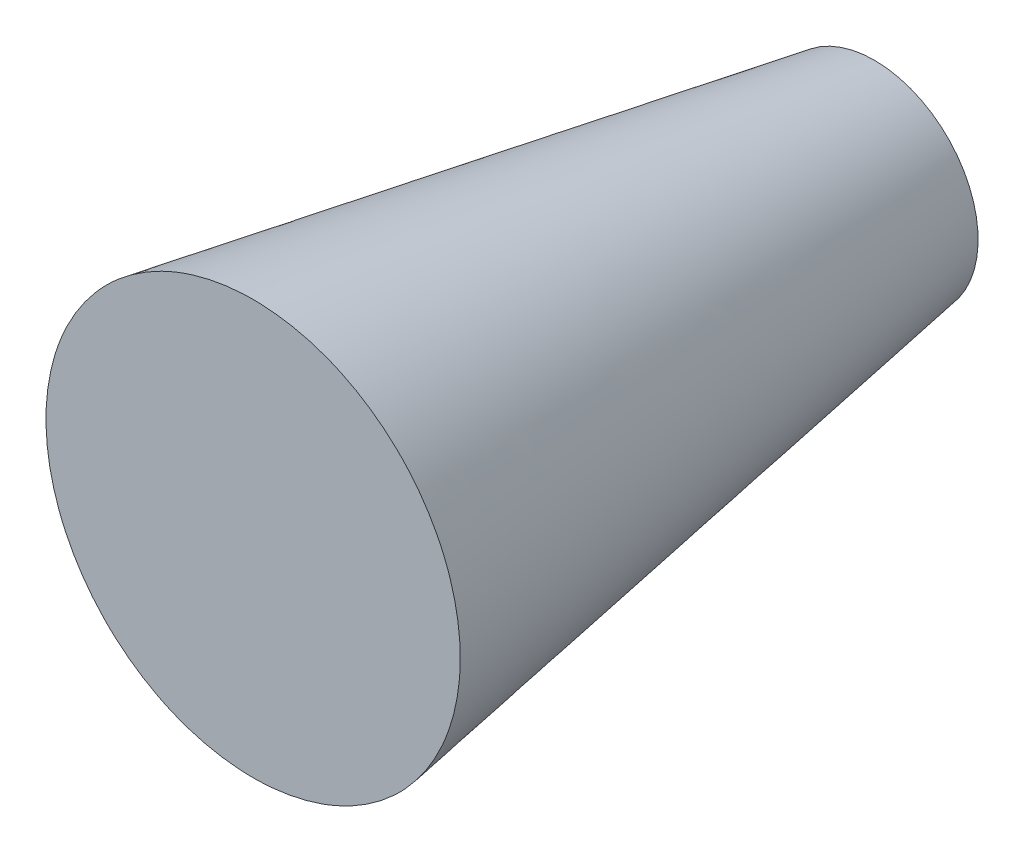
ISO-10303-21;
HEADER;
FILE_DESCRIPTION(('STEP AP214'),'2;1');
FILE_NAME('part.step','',(''),(''),'','','');
FILE_SCHEMA(('AUTOMOTIVE_DESIGN { 1 0 10303 214 1 1 1 1 }'));
ENDSEC;
DATA;
#1=APPLICATION_CONTEXT('core data for automotive mechanical design processes');
#2=APPLICATION_PROTOCOL_DEFINITION('international standard','automotive_design',2000,#1);
#3=PRODUCT_CONTEXT('',#1,'mechanical');
#4=PRODUCT('Part','Part','',(#3));
#5=PRODUCT_RELATED_PRODUCT_CATEGORY('part','',(#4));
#6=PRODUCT_DEFINITION_FORMATION('','',#4);
#7=PRODUCT_DEFINITION_CONTEXT('part definition',#1,'design');
#8=PRODUCT_DEFINITION('design','',#6,#7);
#9=PRODUCT_DEFINITION_SHAPE('','',#8);
#10=(LENGTH_UNIT() NAMED_UNIT(*) SI_UNIT(.MILLI.,.METRE.));
#11=(NAMED_UNIT(*) PLANE_ANGLE_UNIT() SI_UNIT($,.RADIAN.));
#12=(NAMED_UNIT(*) SI_UNIT($,.STERADIAN.) SOLID_ANGLE_UNIT());
#13=UNCERTAINTY_MEASURE_WITH_UNIT(LENGTH_MEASURE(1.E-05),#10,'distance_accuracy_value','');
#14=(GEOMETRIC_REPRESENTATION_CONTEXT(3) GLOBAL_UNCERTAINTY_ASSIGNED_CONTEXT((#13)) GLOBAL_UNIT_ASSIGNED_CONTEXT((#10,
#11,#12)) REPRESENTATION_CONTEXT('',''));
#15=CARTESIAN_POINT('',(0.,0.,0.));
#16=DIRECTION('',(0.,0.,1.));
#17=DIRECTION('',(1.,0.,0.));
#18=AXIS2_PLACEMENT_3D('',#15,#16,#17);
#19=CARTESIAN_POINT('',(0.,0.,30.));
#20=DIRECTION('',(0.,0.,1.));
#21=DIRECTION('',(1.,0.,0.));
#22=AXIS2_PLACEMENT_3D('',#19,#20,#21);
#23=PLANE('',#22);
#24=CARTESIAN_POINT('',(0.,0.,30.));
#25=DIRECTION('',(0.,0.,1.));
#26=DIRECTION('',(1.,0.,0.));
#27=AXIS2_PLACEMENT_3D('',#24,#25,#26);
#28=CIRCLE('',#27,10.);
#29=CARTESIAN_POINT('',(-7.07106781186547,7.07106781186548,30.));
#30=VERTEX_POINT('',#29);
#31=EDGE_CURVE('E11',#30,#30,#28,.T.);
#32=ORIENTED_EDGE('',*,*,#31,.T.);
#33=EDGE_LOOP('',(#32));
#34=FACE_BOUND('',#33,.T.);
#35=ADVANCED_FACE('F54',(#34),#23,.T.);
#36=CARTESIAN_POINT('',(0.,0.,0.));
#37=DIRECTION('',(0.,0.,1.));
#38=DIRECTION('',(1.,0.,0.));
#39=AXIS2_PLACEMENT_3D('',#36,#37,#38);
#40=PLANE('',#39);
#41=CARTESIAN_POINT('',(0.,0.,0.));
#42=DIRECTION('',(0.,0.,1.));
#43=DIRECTION('',(1.,0.,0.));
#44=AXIS2_PLACEMENT_3D('',#41,#42,#43);
#45=CIRCLE('',#44,5.);
#46=CARTESIAN_POINT('',(-3.53553390593274,3.53553390593274,0.));
#47=VERTEX_POINT('',#46);
#48=EDGE_CURVE('E62',#47,#47,#45,.T.);
#49=ORIENTED_EDGE('',*,*,#48,.F.);
#50=EDGE_LOOP('',(#49));
#51=FACE_BOUND('',#50,.T.);
#52=ADVANCED_FACE('F88',(#51),#40,.F.);
#53=CARTESIAN_POINT('',(-3.53553390593274,3.53553390593274,0.));
#54=CARTESIAN_POINT('',(-4.12478955692152,4.12478955692153,5.));
#55=CARTESIAN_POINT('',(-5.3033008588991,5.30330085889911,15.));
#56=CARTESIAN_POINT('',(-6.48181216087668,6.48181216087669,25.));
#57=CARTESIAN_POINT('',(-7.07106781186547,7.07106781186548,30.));
#58=CARTESIAN_POINT('',(-3.99833418397762,3.07273362788786,0.));
#59=CARTESIAN_POINT('',(-4.66472321464055,3.5848558992025,5.));
#60=CARTESIAN_POINT('',(-5.99750127596643,4.60910044183179,15.));
#61=CARTESIAN_POINT('',(-7.3302793372923,5.63334498446107,25.));
#62=CARTESIAN_POINT('',(-7.99666836795523,6.14546725577572,30.));
#63=CARTESIAN_POINT('',(-4.73988137718884,1.96345829272912,0.));
#64=CARTESIAN_POINT('',(-5.52984441641297,2.2907054913173,5.));
#65=CARTESIAN_POINT('',(-7.10977049486122,2.94519988849368,15.));
#66=CARTESIAN_POINT('',(-8.68979714530052,3.59964888312453,25.));
#67=CARTESIAN_POINT('',(-9.47981047052017,3.92687338043996,30.));
#68=CARTESIAN_POINT('',(-5.13030806604431,-4.78705745867933E-05,0.));
#69=CARTESIAN_POINT('',(-5.98539399214664,-8.63489264814751E-05,4.99999999999999));
#70=CARTESIAN_POINT('',(-7.6955658443513,-0.000163305630270839,15.));
#71=CARTESIAN_POINT('',(-9.4055901843523,-0.000156019767836563,25.));
#72=CARTESIAN_POINT('',(-10.2606023543528,-0.000152376836619426,30.));
#73=CARTESIAN_POINT('',(-4.73985411507884,-1.96323651718171,0.));
#74=CARTESIAN_POINT('',(-5.52980336060115,-2.29046388773108,5.00000000000001));
#75=CARTESIAN_POINT('',(-7.10970185164578,-2.94491862882982,15.));
#76=CARTESIAN_POINT('',(-8.6896912043091,-3.59933244698498,25.));
#77=CARTESIAN_POINT('',(-9.47968588064075,-3.92653935606256,30.));
#78=CARTESIAN_POINT('',(-3.6276899097696,-3.62772930082488,0.));
#79=CARTESIAN_POINT('',(-4.23231222339808,-4.23235022147391,4.99999999999999));
#80=CARTESIAN_POINT('',(-5.44155685065504,-5.44159206277197,15.));
#81=CARTESIAN_POINT('',(-6.65077425655753,-6.65081722254467,25.));
#82=CARTESIAN_POINT('',(-7.25538295950878,-7.25542980243101,30.));
#83=CARTESIAN_POINT('',(-1.96329274791161,-4.73981644840214,0.));
#84=CARTESIAN_POINT('',(-2.2905199750829,-5.5297678737538,5.));
#85=CARTESIAN_POINT('',(-2.94497442942548,-7.10967072445712,15.));
#86=CARTESIAN_POINT('',(-3.59939648741167,-8.68965132271249,25.));
#87=CARTESIAN_POINT('',(-3.92660751640476,-9.47964162184016,30.));
#88=CARTESIAN_POINT('',(4.58371486652259E-05,-5.13035866029945,0.));
#89=CARTESIAN_POINT('',(1.40580893779295E-05,-5.98544308759063,5.00000000000001));
#90=CARTESIAN_POINT('',(-4.95000291966634E-05,-7.695611942173,15.));
#91=CARTESIAN_POINT('',(-3.89151037353576E-05,-9.4056460577763,25.));
#92=CARTESIAN_POINT('',(-3.36226410047047E-05,-10.2606631155779,30.));
#93=CARTESIAN_POINT('',(1.9632873482451,-4.73979501728987,0.));
#94=CARTESIAN_POINT('',(2.29051642291841,-5.52976012636071,4.99999999999999));
#95=CARTESIAN_POINT('',(2.94497457226501,-7.1096903445024,15.));
#96=CARTESIAN_POINT('',(3.59940436648306,-8.68969108694635,25.));
#97=CARTESIAN_POINT('',(3.92661926359208,-9.47969145816832,30.0000000000001));
#98=CARTESIAN_POINT('',(3.62775049780074,-3.62775049780076,0.));
#99=CARTESIAN_POINT('',(4.23234856780707,-4.23234856780708,5.00000000000001));
#100=CARTESIAN_POINT('',(5.44154470781973,-5.44154470781972,15.));
#101=CARTESIAN_POINT('',(6.65075833300099,-6.65075833300098,24.9999999999999));
#102=CARTESIAN_POINT('',(7.25536514559162,-7.25536514559161,29.9999999999999));
#103=CARTESIAN_POINT('',(4.73979501728987,-1.96328734824511,0.));
#104=CARTESIAN_POINT('',(5.52976012636071,-2.29051642291841,4.99999999999999));
#105=CARTESIAN_POINT('',(7.10969034450238,-2.94497457226501,15.));
#106=CARTESIAN_POINT('',(8.68969108694632,-3.59940436648309,25.0000000000001));
#107=CARTESIAN_POINT('',(9.47969145816829,-3.92661926359213,30.0000000000002));
#108=CARTESIAN_POINT('',(5.13035866029943,-4.58371486960173E-05,0.));
#109=CARTESIAN_POINT('',(5.98544308759064,-1.40580893950599E-05,5.));
#110=CARTESIAN_POINT('',(7.69561194217305,4.95000292068549E-05,15.));
#111=CARTESIAN_POINT('',(9.40564605777632,3.89151037373092E-05,24.9999999999999));
#112=CARTESIAN_POINT('',(10.260663115578,3.36226410025363E-05,29.9999999999999));
#113=CARTESIAN_POINT('',(4.73981644840215,1.9632927479116,0.));
#114=CARTESIAN_POINT('',(5.52976787375379,2.29051997508289,5.));
#115=CARTESIAN_POINT('',(7.10967072445707,2.94497442942547,15.));
#116=CARTESIAN_POINT('',(8.68965132271246,3.59939648741163,25.0000000000001));
#117=CARTESIAN_POINT('',(9.47964162184016,3.92660751640471,30.0000000000001));
#118=CARTESIAN_POINT('',(3.62772930082489,3.62768990976957,0.));
#119=CARTESIAN_POINT('',(4.23235022147392,4.23231222339806,4.99999999999999));
#120=CARTESIAN_POINT('',(5.44159206277199,5.44155685065505,15.));
#121=CARTESIAN_POINT('',(6.6508172225447,6.65077425655754,24.9999999999999));
#122=CARTESIAN_POINT('',(7.25542980243105,7.25538295950879,29.9999999999999));
#123=CARTESIAN_POINT('',(1.96323651718172,4.73985411507885,0.));
#124=CARTESIAN_POINT('',(2.29046388773109,5.52980336060115,5.00000000000001));
#125=CARTESIAN_POINT('',(2.94491862882983,7.10970185164574,15.));
#126=CARTESIAN_POINT('',(3.59933244698497,8.68969120430907,25.0000000000001));
#127=CARTESIAN_POINT('',(3.92653935606254,9.47968588064074,30.0000000000001));
#128=CARTESIAN_POINT('',(4.78705745998037E-05,5.13030806604429,0.));
#129=CARTESIAN_POINT('',(8.63489264945217E-05,5.98539399214664,4.99999999999999));
#130=CARTESIAN_POINT('',(0.000163305630283958,7.69556584435133,15.));
#131=CARTESIAN_POINT('',(0.000156019767863199,9.40559018435231,25.));
#132=CARTESIAN_POINT('',(0.000152376836652819,10.2606023543528,29.9999999999999));
#133=CARTESIAN_POINT('',(-1.96345829272911,4.73988137718885,0.));
#134=CARTESIAN_POINT('',(-2.2907054913173,5.52984441641298,5.00000000000001));
#135=CARTESIAN_POINT('',(-2.94519988849368,7.10977049486122,15.));
#136=CARTESIAN_POINT('',(-3.59964888312453,8.68979714530053,25.));
#137=CARTESIAN_POINT('',(-3.92687338043996,9.47981047052018,30.));
#138=CARTESIAN_POINT('',(-3.07273362788785,3.99833418397762,0.));
#139=CARTESIAN_POINT('',(-3.5848558992025,4.66472321464056,5.));
#140=CARTESIAN_POINT('',(-4.60910044183178,5.99750127596643,15.));
#141=CARTESIAN_POINT('',(-5.63334498446107,7.33027933729231,25.));
#142=CARTESIAN_POINT('',(-6.14546725577571,7.99666836795524,30.));
#143=CARTESIAN_POINT('',(-3.53553390593274,3.53553390593274,0.));
#144=CARTESIAN_POINT('',(-4.12478955692152,4.12478955692153,5.));
#145=CARTESIAN_POINT('',(-5.3033008588991,5.30330085889911,15.));
#146=CARTESIAN_POINT('',(-6.48181216087668,6.48181216087669,25.));
#147=CARTESIAN_POINT('',(-7.07106781186547,7.07106781186548,30.));
#148=B_SPLINE_SURFACE_WITH_KNOTS('',3,3,((#53,#54,#55,#56,#57),(#58,#59,#60,#61,#62),(#63,#64,
#65,#66,#67),(#68,#69,#70,#71,#72),(#73,#74,#75,#76,#77),(#78,#79,#80,#81,#82),(#83,#84,#85,#86,
#87),(#88,#89,#90,#91,#92),(#93,#94,#95,#96,#97),(#98,#99,#100,#101,#102),(#103,#104,#105,#106,
#107),(#108,#109,#110,#111,#112),(#113,#114,#115,#116,#117),(#118,#119,#120,#121,#122),(#123,
#124,#125,#126,#127),(#128,#129,#130,#131,#132),(#133,#134,#135,#136,#137),(#138,#139,#140,#141,
#142),(#143,#144,#145,#146,#147)),.UNSPECIFIED.,.T.,.F.,.F.,(4,1,1,1,1,1,1,1,1,1,1,1,1,1,1,1,4),
(4,1,4),(0.,0.0625,0.125,0.1875,0.25,0.3125,0.375,0.4375,0.5,0.5625,0.625,0.6875,0.75,0.8125,
0.875,0.9375,1.),(0.,0.5,1.),.UNSPECIFIED.);
#149=CARTESIAN_POINT('',(-3.53553390593274,3.53553390593274,0.));
#150=CARTESIAN_POINT('',(-3.57236238411953,3.57236238411954,0.3125));
#151=CARTESIAN_POINT('',(-3.60919086230633,3.60919086230634,0.625));
#152=CARTESIAN_POINT('',(-3.68284781867993,3.68284781867994,1.25));
#153=CARTESIAN_POINT('',(-3.71967629686673,3.71967629686674,1.5625));
#154=CARTESIAN_POINT('',(-3.79333325324033,3.79333325324033,2.1875));
#155=CARTESIAN_POINT('',(-3.83016173142713,3.83016173142713,2.5));
#156=CARTESIAN_POINT('',(-3.90381868780073,3.90381868780073,3.125));
#157=CARTESIAN_POINT('',(-3.94064716598753,3.94064716598753,3.4375));
#158=CARTESIAN_POINT('',(-4.01430412236113,4.01430412236113,4.0625));
#159=CARTESIAN_POINT('',(-4.05113260054793,4.05113260054793,4.375));
#160=CARTESIAN_POINT('',(-4.12478955692152,4.12478955692153,5.));
#161=CARTESIAN_POINT('',(-4.16161803510832,4.16161803510833,5.3125));
#162=CARTESIAN_POINT('',(-4.23527499148192,4.23527499148193,5.9375));
#163=CARTESIAN_POINT('',(-4.27210346966872,4.27210346966873,6.25));
#164=CARTESIAN_POINT('',(-4.34576042604232,4.34576042604232,6.875));
#165=CARTESIAN_POINT('',(-4.38258890422912,4.38258890422912,7.1875));
#166=CARTESIAN_POINT('',(-4.45624586060272,4.45624586060272,7.8125));
#167=CARTESIAN_POINT('',(-4.49307433878952,4.49307433878952,8.125));
#168=CARTESIAN_POINT('',(-4.56673129516312,4.56673129516312,8.75));
#169=CARTESIAN_POINT('',(-4.60355977334991,4.60355977334992,9.0625));
#170=CARTESIAN_POINT('',(-4.67721672972351,4.67721672972352,9.6875));
#171=CARTESIAN_POINT('',(-4.71404520791031,4.71404520791032,10.));
#172=CARTESIAN_POINT('',(-4.78770216428391,4.78770216428392,10.625));
#173=CARTESIAN_POINT('',(-4.82453064247071,4.82453064247072,10.9375));
#174=CARTESIAN_POINT('',(-4.89818759884431,4.89818759884432,11.5625));
#175=CARTESIAN_POINT('',(-4.93501607703111,4.93501607703112,11.875));
#176=CARTESIAN_POINT('',(-5.00867303340471,5.00867303340471,12.5));
#177=CARTESIAN_POINT('',(-5.04550151159151,5.04550151159151,12.8125));
#178=CARTESIAN_POINT('',(-5.11915846796511,5.11915846796511,13.4375));
#179=CARTESIAN_POINT('',(-5.15598694615191,5.15598694615191,13.75));
#180=CARTESIAN_POINT('',(-5.2296439025255,5.22964390252551,14.375));
#181=CARTESIAN_POINT('',(-5.2664723807123,5.26647238071231,14.6875));
#182=CARTESIAN_POINT('',(-5.3401293370859,5.34012933708591,15.3125));
#183=CARTESIAN_POINT('',(-5.3769578152727,5.37695781527271,15.625));
#184=CARTESIAN_POINT('',(-5.4506147716463,5.45061477164631,16.25));
#185=CARTESIAN_POINT('',(-5.4874432498331,5.4874432498331,16.5625));
#186=CARTESIAN_POINT('',(-5.5611002062067,5.5611002062067,17.1875));
#187=CARTESIAN_POINT('',(-5.5979286843935,5.5979286843935,17.5));
#188=CARTESIAN_POINT('',(-5.6715856407671,5.6715856407671,18.125));
#189=CARTESIAN_POINT('',(-5.7084141189539,5.7084141189539,18.4375));
#190=CARTESIAN_POINT('',(-5.78207107532749,5.7820710753275,19.0625));
#191=CARTESIAN_POINT('',(-5.81889955351429,5.8188995535143,19.375));
#192=CARTESIAN_POINT('',(-5.89255650988789,5.8925565098879,20.));
#193=CARTESIAN_POINT('',(-5.92938498807469,5.9293849880747,20.3125));
#194=CARTESIAN_POINT('',(-6.00304194444829,6.0030419444483,20.9375));
#195=CARTESIAN_POINT('',(-6.03987042263509,6.0398704226351,21.25));
#196=CARTESIAN_POINT('',(-6.11352737900869,6.1135273790087,21.875));
#197=CARTESIAN_POINT('',(-6.15035585719549,6.15035585719549,22.1875));
#198=CARTESIAN_POINT('',(-6.22401281356909,6.22401281356909,22.8125));
#199=CARTESIAN_POINT('',(-6.26084129175588,6.26084129175589,23.125));
#200=CARTESIAN_POINT('',(-6.33449824812948,6.33449824812949,23.75));
#201=CARTESIAN_POINT('',(-6.37132672631628,6.37132672631629,24.0625));
#202=CARTESIAN_POINT('',(-6.44498368268988,6.44498368268989,24.6875));
#203=CARTESIAN_POINT('',(-6.48181216087668,6.48181216087669,25.));
#204=CARTESIAN_POINT('',(-6.55546911725028,6.55546911725029,25.625));
#205=CARTESIAN_POINT('',(-6.59229759543708,6.59229759543709,25.9375));
#206=CARTESIAN_POINT('',(-6.66595455181068,6.66595455181068,26.5625));
#207=CARTESIAN_POINT('',(-6.70278302999748,6.70278302999748,26.875));
#208=CARTESIAN_POINT('',(-6.77643998637108,6.77643998637108,27.5));
#209=CARTESIAN_POINT('',(-6.81326846455788,6.81326846455788,27.8125));
#210=CARTESIAN_POINT('',(-6.88692542093148,6.88692542093148,28.4375));
#211=CARTESIAN_POINT('',(-6.92375389911827,6.92375389911828,28.75));
#212=CARTESIAN_POINT('',(-6.99741085549187,6.99741085549188,29.375));
#213=CARTESIAN_POINT('',(-7.03423933367867,7.03423933367868,29.6875));
#214=CARTESIAN_POINT('',(-7.07106781186547,7.07106781186548,30.));
#215=B_SPLINE_CURVE_WITH_KNOTS('',3,(#149,#150,#151,#152,#153,#154,#155,#156,#157,#158,#159,
#160,#161,#162,#163,#164,#165,#166,#167,#168,#169,#170,#171,#172,#173,#174,#175,#176,#177,#178,
#179,#180,#181,#182,#183,#184,#185,#186,#187,#188,#189,#190,#191,#192,#193,#194,#195,#196,#197,
#198,#199,#200,#201,#202,#203,#204,#205,#206,#207,#208,#209,#210,#211,#212,#213,#214),
.UNSPECIFIED.,.F.,.F.,(4,2,2,2,2,2,2,2,2,2,2,2,2,2,2,2,2,2,2,2,2,2,2,2,2,2,2,2,2,2,2,2,4),(0.,
0.950431645359097,1.90086329071819,2.85129493607729,3.80172658143639,4.75215822679548,
5.70258987215458,6.65302151751368,7.60345316287277,8.55388480823187,9.50431645359096,
10.4547480989501,11.4051797443092,12.3556113896683,13.3060430350274,14.2564746803865,
15.2069063257455,16.1573379711046,17.1077696164637,18.0582012618228,19.0086329071819,
19.959064552541,20.9094961979001,21.8599278432592,22.8103594886183,23.7607911339774,
24.7112227793365,25.6616544246956,26.6120860700547,27.5625177154138,28.5129493607729,
29.463381006132,30.4138126514911),.UNSPECIFIED.);
#216=EDGE_CURVE('BSEAM94',#47,#30,#215,.T.);
#217=ORIENTED_EDGE('',*,*,#48,.T.);
#218=ORIENTED_EDGE('',*,*,#31,.F.);
#219=ORIENTED_EDGE('',*,*,#216,.T.);
#220=ORIENTED_EDGE('',*,*,#216,.F.);
#221=EDGE_LOOP('',(#217,#219,#218,#220));
#222=FACE_BOUND('',#221,.T.);
#223=ADVANCED_FACE('F94',(#222),#148,.T.);
#224=CLOSED_SHELL('',(#35,#52,#223));
#225=MANIFOLD_SOLID_BREP('B2',#224);
#226=ADVANCED_BREP_SHAPE_REPRESENTATION('',(#18,#225),#14);
#227=SHAPE_DEFINITION_REPRESENTATION(#9,#226);
ENDSEC;
END-ISO-10303-21;
